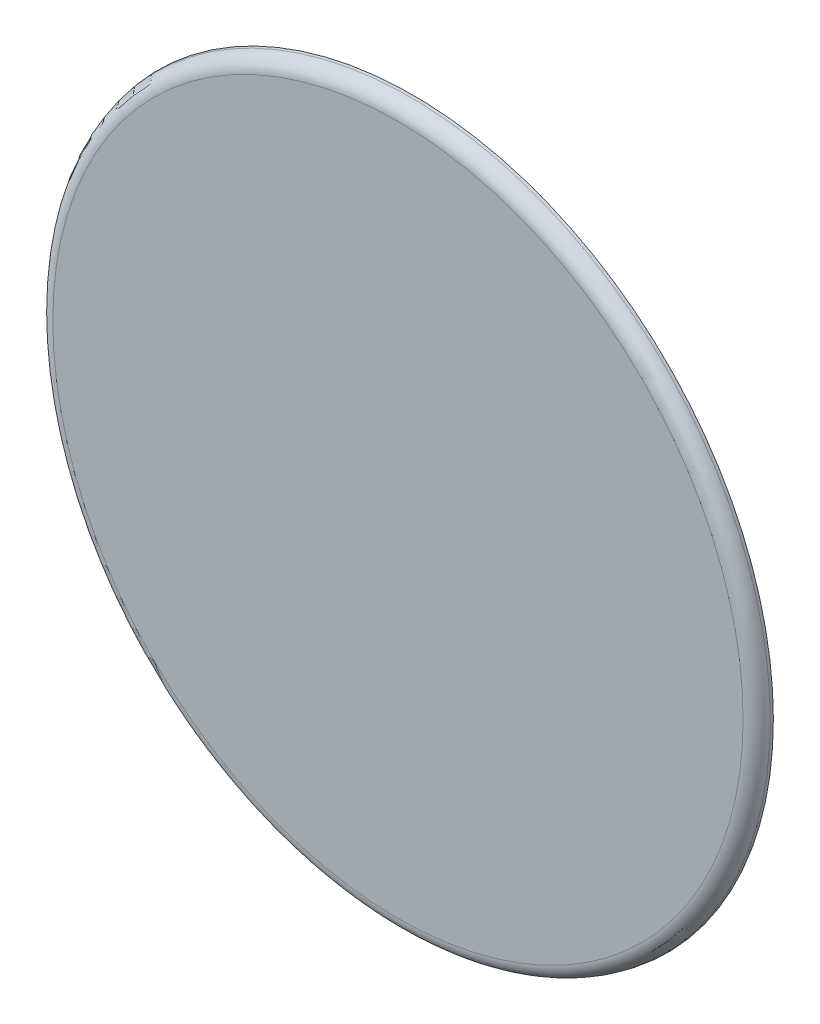
ISO-10303-21;
HEADER;
FILE_DESCRIPTION(('STEP AP214'),'2;1');
FILE_NAME('part.step','',(''),(''),'','','');
FILE_SCHEMA(('AUTOMOTIVE_DESIGN { 1 0 10303 214 1 1 1 1 }'));
ENDSEC;
DATA;
#1=APPLICATION_CONTEXT('core data for automotive mechanical design processes');
#2=APPLICATION_PROTOCOL_DEFINITION('international standard','automotive_design',2000,#1);
#3=PRODUCT_CONTEXT('',#1,'mechanical');
#4=PRODUCT('Part','Part','',(#3));
#5=PRODUCT_RELATED_PRODUCT_CATEGORY('part','',(#4));
#6=PRODUCT_DEFINITION_FORMATION('','',#4);
#7=PRODUCT_DEFINITION_CONTEXT('part definition',#1,'design');
#8=PRODUCT_DEFINITION('design','',#6,#7);
#9=PRODUCT_DEFINITION_SHAPE('','',#8);
#10=(LENGTH_UNIT() NAMED_UNIT(*) SI_UNIT(.MILLI.,.METRE.));
#11=(NAMED_UNIT(*) PLANE_ANGLE_UNIT() SI_UNIT($,.RADIAN.));
#12=(NAMED_UNIT(*) SI_UNIT($,.STERADIAN.) SOLID_ANGLE_UNIT());
#13=UNCERTAINTY_MEASURE_WITH_UNIT(LENGTH_MEASURE(1.E-05),#10,'distance_accuracy_value','');
#14=(GEOMETRIC_REPRESENTATION_CONTEXT(3) GLOBAL_UNCERTAINTY_ASSIGNED_CONTEXT((#13)) GLOBAL_UNIT_ASSIGNED_CONTEXT((#10,
#11,#12)) REPRESENTATION_CONTEXT('',''));
#15=CARTESIAN_POINT('',(0.,0.,0.));
#16=DIRECTION('',(0.,0.,1.));
#17=DIRECTION('',(1.,0.,0.));
#18=AXIS2_PLACEMENT_3D('',#15,#16,#17);
#19=CARTESIAN_POINT('',(0.,0.,0.));
#20=DIRECTION('',(0.,0.,-1.));
#21=DIRECTION('',(1.,0.,0.));
#22=AXIS2_PLACEMENT_3D('',#19,#20,#21);
#23=CONICAL_SURFACE('',#22,240.,0.174532925199433);
#24=CARTESIAN_POINT('',(0.,0.,1.73648177666931));
#25=DIRECTION('',(0.,0.,-1.));
#26=DIRECTION('',(-1.,0.,0.));
#27=AXIS2_PLACEMENT_3D('',#24,#25,#26);
#28=CIRCLE('',#27,239.693811411265);
#29=CARTESIAN_POINT('',(-239.693811411265,0.,1.73648177666931));
#30=VERTEX_POINT('',#29);
#31=EDGE_CURVE('E10',#30,#30,#28,.T.);
#32=ORIENTED_EDGE('',*,*,#31,.T.);
#33=EDGE_LOOP('',(#32));
#34=FACE_BOUND('',#33,.T.);
#35=CARTESIAN_POINT('',(0.,0.,0.));
#36=DIRECTION('',(0.,0.,1.));
#37=DIRECTION('',(1.,0.,0.));
#38=AXIS2_PLACEMENT_3D('',#35,#36,#37);
#39=CIRCLE('',#38,240.);
#40=CARTESIAN_POINT('',(240.,0.,0.));
#41=VERTEX_POINT('',#40);
#42=EDGE_CURVE('E45',#41,#41,#39,.T.);
#43=ORIENTED_EDGE('',*,*,#42,.T.);
#44=EDGE_LOOP('',(#43));
#45=FACE_BOUND('',#44,.T.);
#46=ADVANCED_FACE('F34',(#34,#45),#23,.T.);
#47=CARTESIAN_POINT('',(0.,0.,10.));
#48=DIRECTION('',(0.,0.,1.));
#49=DIRECTION('',(1.,0.,0.));
#50=AXIS2_PLACEMENT_3D('',#47,#48,#49);
#51=PLANE('',#50);
#52=CARTESIAN_POINT('',(0.,0.,10.));
#53=DIRECTION('',(0.,0.,1.));
#54=DIRECTION('',(1.,0.,0.));
#55=AXIS2_PLACEMENT_3D('',#52,#53,#54);
#56=CIRCLE('',#55,229.845733881143);
#57=CARTESIAN_POINT('',(229.845733881143,0.,10.));
#58=VERTEX_POINT('',#57);
#59=EDGE_CURVE('E41',#58,#58,#56,.T.);
#60=ORIENTED_EDGE('',*,*,#59,.T.);
#61=EDGE_LOOP('',(#60));
#62=FACE_BOUND('',#61,.T.);
#63=ADVANCED_FACE('F55',(#62),#51,.T.);
#64=CARTESIAN_POINT('',(0.,0.,0.));
#65=DIRECTION('',(0.,0.,1.));
#66=DIRECTION('',(1.,0.,0.));
#67=AXIS2_PLACEMENT_3D('',#64,#65,#66);
#68=PLANE('',#67);
#69=ORIENTED_EDGE('',*,*,#42,.F.);
#70=EDGE_LOOP('',(#69));
#71=FACE_BOUND('',#70,.T.);
#72=ADVANCED_FACE('F53',(#71),#68,.F.);
#73=CARTESIAN_POINT('',(0.,0.,0.));
#74=DIRECTION('',(0.,0.,1.));
#75=DIRECTION('',(1.,0.,0.));
#76=AXIS2_PLACEMENT_3D('',#73,#74,#75);
#77=TOROIDAL_SURFACE('',#76,229.845733881143,10.);
#78=ORIENTED_EDGE('',*,*,#31,.F.);
#79=EDGE_LOOP('',(#78));
#80=FACE_BOUND('',#79,.T.);
#81=ORIENTED_EDGE('',*,*,#59,.F.);
#82=EDGE_LOOP('',(#81));
#83=FACE_BOUND('',#82,.T.);
#84=ADVANCED_FACE('F36',(#80,#83),#77,.T.);
#85=CLOSED_SHELL('',(#46,#63,#72,#84));
#86=MANIFOLD_SOLID_BREP('B2',#85);
#87=ADVANCED_BREP_SHAPE_REPRESENTATION('',(#18,#86),#14);
#88=SHAPE_DEFINITION_REPRESENTATION(#9,#87);
ENDSEC;
END-ISO-10303-21;
